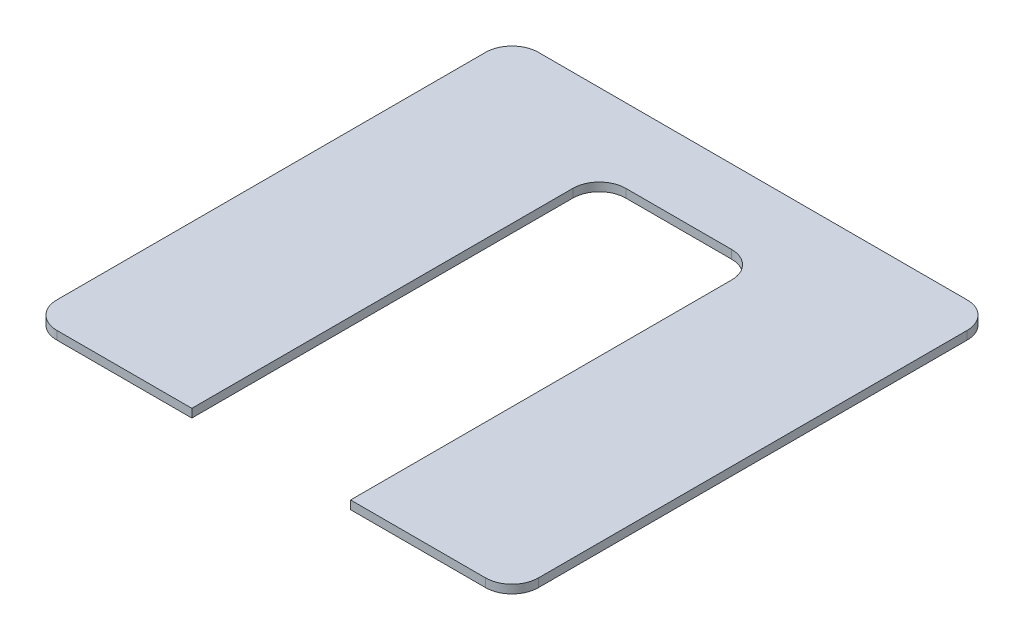
ISO-10303-21;
HEADER;
FILE_DESCRIPTION(('STEP AP214'),'2;1');
FILE_NAME('part.step','',(''),(''),'','','');
FILE_SCHEMA(('AUTOMOTIVE_DESIGN { 1 0 10303 214 1 1 1 1 }'));
ENDSEC;
DATA;
#1=APPLICATION_CONTEXT('core data for automotive mechanical design processes');
#2=APPLICATION_PROTOCOL_DEFINITION('international standard','automotive_design',2000,#1);
#3=PRODUCT_CONTEXT('',#1,'mechanical');
#4=PRODUCT('Part','Part','',(#3));
#5=PRODUCT_RELATED_PRODUCT_CATEGORY('part','',(#4));
#6=PRODUCT_DEFINITION_FORMATION('','',#4);
#7=PRODUCT_DEFINITION_CONTEXT('part definition',#1,'design');
#8=PRODUCT_DEFINITION('design','',#6,#7);
#9=PRODUCT_DEFINITION_SHAPE('','',#8);
#10=(LENGTH_UNIT() NAMED_UNIT(*) SI_UNIT(.MILLI.,.METRE.));
#11=(NAMED_UNIT(*) PLANE_ANGLE_UNIT() SI_UNIT($,.RADIAN.));
#12=(NAMED_UNIT(*) SI_UNIT($,.STERADIAN.) SOLID_ANGLE_UNIT());
#13=UNCERTAINTY_MEASURE_WITH_UNIT(LENGTH_MEASURE(1.E-05),#10,'distance_accuracy_value','');
#14=(GEOMETRIC_REPRESENTATION_CONTEXT(3) GLOBAL_UNCERTAINTY_ASSIGNED_CONTEXT((#13)) GLOBAL_UNIT_ASSIGNED_CONTEXT((#10,
#11,#12)) REPRESENTATION_CONTEXT('',''));
#15=CARTESIAN_POINT('',(0.,0.,0.));
#16=DIRECTION('',(0.,0.,1.));
#17=DIRECTION('',(1.,0.,0.));
#18=AXIS2_PLACEMENT_3D('',#15,#16,#17);
#19=CARTESIAN_POINT('',(-45.5,1.6,45.5));
#20=DIRECTION('',(0.,0.,-1.));
#21=DIRECTION('',(-1.,0.,0.));
#22=AXIS2_PLACEMENT_3D('',#19,#20,#21);
#23=PLANE('',#22);
#24=DIRECTION('',(1.,0.,0.));
#25=VECTOR('',#24,1.);
#26=CARTESIAN_POINT('',(-45.5,0.,45.5));
#27=LINE('',#26,#25);
#28=CARTESIAN_POINT('',(15.,0.,45.5));
#29=VERTEX_POINT('',#28);
#30=CARTESIAN_POINT('',(40.5,0.,45.5));
#31=VERTEX_POINT('',#30);
#32=EDGE_CURVE('E146',#29,#31,#27,.T.);
#33=ORIENTED_EDGE('',*,*,#32,.T.);
#34=DIRECTION('',(0.,-1.,0.));
#35=VECTOR('',#34,1.);
#36=CARTESIAN_POINT('',(40.5,1.6,45.5));
#37=LINE('',#36,#35);
#38=CARTESIAN_POINT('',(40.5,1.6,45.5));
#39=VERTEX_POINT('',#38);
#40=EDGE_CURVE('E215',#31,#39,#37,.F.);
#41=ORIENTED_EDGE('',*,*,#40,.T.);
#42=DIRECTION('',(1.,0.,0.));
#43=VECTOR('',#42,1.);
#44=CARTESIAN_POINT('',(-45.5,1.6,45.5));
#45=LINE('',#44,#43);
#46=CARTESIAN_POINT('',(15.,1.6,45.5));
#47=VERTEX_POINT('',#46);
#48=EDGE_CURVE('E174',#47,#39,#45,.T.);
#49=ORIENTED_EDGE('',*,*,#48,.F.);
#50=DIRECTION('',(0.,1.,0.));
#51=VECTOR('',#50,1.);
#52=CARTESIAN_POINT('',(15.,0.,45.5));
#53=LINE('',#52,#51);
#54=EDGE_CURVE('E160',#29,#47,#53,.T.);
#55=ORIENTED_EDGE('',*,*,#54,.F.);
#56=EDGE_LOOP('',(#33,#41,#49,#55));
#57=FACE_BOUND('',#56,.T.);
#58=ADVANCED_FACE('F34',(#57),#23,.F.);
#59=CARTESIAN_POINT('',(-45.5,1.6,45.5));
#60=DIRECTION('',(-1.,0.,0.));
#61=DIRECTION('',(0.,0.,1.));
#62=AXIS2_PLACEMENT_3D('',#59,#60,#61);
#63=PLANE('',#62);
#64=DIRECTION('',(0.,0.,-1.));
#65=VECTOR('',#64,1.);
#66=CARTESIAN_POINT('',(-45.5,1.6,45.5));
#67=LINE('',#66,#65);
#68=CARTESIAN_POINT('',(-45.5,1.6,40.5));
#69=VERTEX_POINT('',#68);
#70=CARTESIAN_POINT('',(-45.5,1.6,-40.5));
#71=VERTEX_POINT('',#70);
#72=EDGE_CURVE('E145',#69,#71,#67,.T.);
#73=ORIENTED_EDGE('',*,*,#72,.T.);
#74=DIRECTION('',(0.,-1.,0.));
#75=VECTOR('',#74,1.);
#76=CARTESIAN_POINT('',(-45.5,1.6,-40.5));
#77=LINE('',#76,#75);
#78=CARTESIAN_POINT('',(-45.5,0.,-40.5));
#79=VERTEX_POINT('',#78);
#80=EDGE_CURVE('E186',#71,#79,#77,.T.);
#81=ORIENTED_EDGE('',*,*,#80,.T.);
#82=DIRECTION('',(0.,0.,-1.));
#83=VECTOR('',#82,1.);
#84=CARTESIAN_POINT('',(-45.5,0.,45.5));
#85=LINE('',#84,#83);
#86=CARTESIAN_POINT('',(-45.5,0.,40.5));
#87=VERTEX_POINT('',#86);
#88=EDGE_CURVE('E162',#87,#79,#85,.T.);
#89=ORIENTED_EDGE('',*,*,#88,.F.);
#90=DIRECTION('',(0.,-1.,0.));
#91=VECTOR('',#90,1.);
#92=CARTESIAN_POINT('',(-45.5,1.6,40.5));
#93=LINE('',#92,#91);
#94=EDGE_CURVE('E177',#87,#69,#93,.F.);
#95=ORIENTED_EDGE('',*,*,#94,.T.);
#96=EDGE_LOOP('',(#73,#81,#89,#95));
#97=FACE_BOUND('',#96,.T.);
#98=ADVANCED_FACE('F248',(#97),#63,.T.);
#99=CARTESIAN_POINT('',(-40.5,1.6,45.5));
#100=VERTEX_POINT('',#99);
#101=CARTESIAN_POINT('',(-15.,1.6,45.5));
#102=VERTEX_POINT('',#101);
#103=EDGE_CURVE('E175',#100,#102,#45,.T.);
#104=ORIENTED_EDGE('',*,*,#103,.F.);
#105=DIRECTION('',(0.,-1.,0.));
#106=VECTOR('',#105,1.);
#107=CARTESIAN_POINT('',(-40.5,0.,45.5));
#108=LINE('',#107,#106);
#109=CARTESIAN_POINT('',(-40.5,0.,45.5));
#110=VERTEX_POINT('',#109);
#111=EDGE_CURVE('E143',#100,#110,#108,.T.);
#112=ORIENTED_EDGE('',*,*,#111,.T.);
#113=CARTESIAN_POINT('',(-15.,0.,45.5));
#114=VERTEX_POINT('',#113);
#115=EDGE_CURVE('E137',#110,#114,#27,.T.);
#116=ORIENTED_EDGE('',*,*,#115,.T.);
#117=DIRECTION('',(0.,1.,0.));
#118=VECTOR('',#117,1.);
#119=CARTESIAN_POINT('',(-15.,0.,45.5));
#120=LINE('',#119,#118);
#121=EDGE_CURVE('E141',#114,#102,#120,.T.);
#122=ORIENTED_EDGE('',*,*,#121,.T.);
#123=EDGE_LOOP('',(#104,#112,#116,#122));
#124=FACE_BOUND('',#123,.T.);
#125=ADVANCED_FACE('F139',(#124),#23,.F.);
#126=CARTESIAN_POINT('',(45.5,1.6,45.5));
#127=DIRECTION('',(-1.,0.,0.));
#128=DIRECTION('',(0.,0.,1.));
#129=AXIS2_PLACEMENT_3D('',#126,#127,#128);
#130=PLANE('',#129);
#131=DIRECTION('',(0.,0.,-1.));
#132=VECTOR('',#131,1.);
#133=CARTESIAN_POINT('',(45.5,1.6,45.5));
#134=LINE('',#133,#132);
#135=CARTESIAN_POINT('',(45.5,1.6,40.5));
#136=VERTEX_POINT('',#135);
#137=CARTESIAN_POINT('',(45.5,1.6,-40.5));
#138=VERTEX_POINT('',#137);
#139=EDGE_CURVE('E171',#136,#138,#134,.T.);
#140=ORIENTED_EDGE('',*,*,#139,.F.);
#141=DIRECTION('',(0.,-1.,0.));
#142=VECTOR('',#141,1.);
#143=CARTESIAN_POINT('',(45.5,1.6,40.5));
#144=LINE('',#143,#142);
#145=CARTESIAN_POINT('',(45.5,0.,40.5));
#146=VERTEX_POINT('',#145);
#147=EDGE_CURVE('E212',#136,#146,#144,.T.);
#148=ORIENTED_EDGE('',*,*,#147,.T.);
#149=DIRECTION('',(0.,0.,-1.));
#150=VECTOR('',#149,1.);
#151=CARTESIAN_POINT('',(45.5,0.,45.5));
#152=LINE('',#151,#150);
#153=CARTESIAN_POINT('',(45.5,0.,-40.5));
#154=VERTEX_POINT('',#153);
#155=EDGE_CURVE('E182',#146,#154,#152,.T.);
#156=ORIENTED_EDGE('',*,*,#155,.T.);
#157=DIRECTION('',(0.,-1.,0.));
#158=VECTOR('',#157,1.);
#159=CARTESIAN_POINT('',(45.5,1.6,-40.5));
#160=LINE('',#159,#158);
#161=EDGE_CURVE('E210',#154,#138,#160,.F.);
#162=ORIENTED_EDGE('',*,*,#161,.T.);
#163=EDGE_LOOP('',(#140,#148,#156,#162));
#164=FACE_BOUND('',#163,.T.);
#165=ADVANCED_FACE('F260',(#164),#130,.F.);
#166=CARTESIAN_POINT('',(-45.5,1.6,-45.5));
#167=DIRECTION('',(0.,0.,-1.));
#168=DIRECTION('',(-1.,0.,0.));
#169=AXIS2_PLACEMENT_3D('',#166,#167,#168);
#170=PLANE('',#169);
#171=DIRECTION('',(1.,0.,0.));
#172=VECTOR('',#171,1.);
#173=CARTESIAN_POINT('',(-45.5,0.,-45.5));
#174=LINE('',#173,#172);
#175=CARTESIAN_POINT('',(-40.5,0.,-45.5));
#176=VERTEX_POINT('',#175);
#177=CARTESIAN_POINT('',(40.5,0.,-45.5));
#178=VERTEX_POINT('',#177);
#179=EDGE_CURVE('E179',#176,#178,#174,.T.);
#180=ORIENTED_EDGE('',*,*,#179,.F.);
#181=DIRECTION('',(0.,-1.,0.));
#182=VECTOR('',#181,1.);
#183=CARTESIAN_POINT('',(-40.5,1.6,-45.5));
#184=LINE('',#183,#182);
#185=CARTESIAN_POINT('',(-40.5,1.6,-45.5));
#186=VERTEX_POINT('',#185);
#187=EDGE_CURVE('E200',#176,#186,#184,.F.);
#188=ORIENTED_EDGE('',*,*,#187,.T.);
#189=DIRECTION('',(1.,0.,0.));
#190=VECTOR('',#189,1.);
#191=CARTESIAN_POINT('',(-45.5,1.6,-45.5));
#192=LINE('',#191,#190);
#193=CARTESIAN_POINT('',(40.5,1.6,-45.5));
#194=VERTEX_POINT('',#193);
#195=EDGE_CURVE('E168',#186,#194,#192,.T.);
#196=ORIENTED_EDGE('',*,*,#195,.T.);
#197=DIRECTION('',(0.,-1.,0.));
#198=VECTOR('',#197,1.);
#199=CARTESIAN_POINT('',(40.5,0.,-45.5));
#200=LINE('',#199,#198);
#201=EDGE_CURVE('E197',#194,#178,#200,.T.);
#202=ORIENTED_EDGE('',*,*,#201,.T.);
#203=EDGE_LOOP('',(#180,#188,#196,#202));
#204=FACE_BOUND('',#203,.T.);
#205=ADVANCED_FACE('F264',(#204),#170,.T.);
#206=CARTESIAN_POINT('',(0.,1.6,0.));
#207=DIRECTION('',(0.,-1.,0.));
#208=DIRECTION('',(0.,0.,-1.));
#209=AXIS2_PLACEMENT_3D('',#206,#207,#208);
#210=PLANE('',#209);
#211=ORIENTED_EDGE('',*,*,#195,.F.);
#212=CARTESIAN_POINT('',(-40.5,1.6,-40.5));
#213=DIRECTION('',(0.,-1.,0.));
#214=DIRECTION('',(0.,0.,-1.));
#215=AXIS2_PLACEMENT_3D('',#212,#213,#214);
#216=CIRCLE('',#215,5.);
#217=EDGE_CURVE('E207',#186,#71,#216,.F.);
#218=ORIENTED_EDGE('',*,*,#217,.T.);
#219=ORIENTED_EDGE('',*,*,#72,.F.);
#220=CARTESIAN_POINT('',(-40.5,1.6,40.5));
#221=DIRECTION('',(0.,-1.,0.));
#222=DIRECTION('',(0.,0.,-1.));
#223=AXIS2_PLACEMENT_3D('',#220,#221,#222);
#224=CIRCLE('',#223,5.);
#225=EDGE_CURVE('E56',#69,#100,#224,.F.);
#226=ORIENTED_EDGE('',*,*,#225,.T.);
#227=ORIENTED_EDGE('',*,*,#103,.T.);
#228=DIRECTION('',(0.,0.,1.));
#229=VECTOR('',#228,1.);
#230=CARTESIAN_POINT('',(-15.,1.6,-31.5));
#231=LINE('',#230,#229);
#232=CARTESIAN_POINT('',(-15.,1.6,-26.5));
#233=VERTEX_POINT('',#232);
#234=EDGE_CURVE('E159',#233,#102,#231,.T.);
#235=ORIENTED_EDGE('',*,*,#234,.F.);
#236=CARTESIAN_POINT('',(-9.99999999999999,1.6,-26.5));
#237=DIRECTION('',(0.,-1.,0.));
#238=DIRECTION('',(0.,0.,-1.));
#239=AXIS2_PLACEMENT_3D('',#236,#237,#238);
#240=CIRCLE('',#239,5.);
#241=CARTESIAN_POINT('',(-9.99999999999999,1.6,-31.5));
#242=VERTEX_POINT('',#241);
#243=EDGE_CURVE('E42',#233,#242,#240,.T.);
#244=ORIENTED_EDGE('',*,*,#243,.T.);
#245=DIRECTION('',(-1.,0.,0.));
#246=VECTOR('',#245,1.);
#247=CARTESIAN_POINT('',(-15.,1.6,-31.5));
#248=LINE('',#247,#246);
#249=CARTESIAN_POINT('',(10.,1.6,-31.5));
#250=VERTEX_POINT('',#249);
#251=EDGE_CURVE('E233',#250,#242,#248,.T.);
#252=ORIENTED_EDGE('',*,*,#251,.F.);
#253=CARTESIAN_POINT('',(10.,1.6,-26.5));
#254=DIRECTION('',(0.,-1.,0.));
#255=DIRECTION('',(0.,0.,-1.));
#256=AXIS2_PLACEMENT_3D('',#253,#254,#255);
#257=CIRCLE('',#256,5.);
#258=CARTESIAN_POINT('',(15.,1.6,-26.5));
#259=VERTEX_POINT('',#258);
#260=EDGE_CURVE('E226',#250,#259,#257,.T.);
#261=ORIENTED_EDGE('',*,*,#260,.T.);
#262=DIRECTION('',(0.,0.,-1.));
#263=VECTOR('',#262,1.);
#264=CARTESIAN_POINT('',(15.,1.6,-31.5));
#265=LINE('',#264,#263);
#266=EDGE_CURVE('E238',#47,#259,#265,.T.);
#267=ORIENTED_EDGE('',*,*,#266,.F.);
#268=ORIENTED_EDGE('',*,*,#48,.T.);
#269=CARTESIAN_POINT('',(40.5,1.6,40.5));
#270=DIRECTION('',(0.,-1.,0.));
#271=DIRECTION('',(0.,0.,-1.));
#272=AXIS2_PLACEMENT_3D('',#269,#270,#271);
#273=CIRCLE('',#272,5.);
#274=EDGE_CURVE('E204',#39,#136,#273,.F.);
#275=ORIENTED_EDGE('',*,*,#274,.T.);
#276=ORIENTED_EDGE('',*,*,#139,.T.);
#277=CARTESIAN_POINT('',(40.5,1.6,-40.5));
#278=DIRECTION('',(0.,-1.,0.));
#279=DIRECTION('',(0.,0.,-1.));
#280=AXIS2_PLACEMENT_3D('',#277,#278,#279);
#281=CIRCLE('',#280,5.);
#282=EDGE_CURVE('E202',#138,#194,#281,.F.);
#283=ORIENTED_EDGE('',*,*,#282,.T.);
#284=EDGE_LOOP('',(#211,#218,#219,#226,#227,#235,#244,#252,#261,#267,#268,#275,#276,#283));
#285=FACE_BOUND('',#284,.T.);
#286=ADVANCED_FACE('F232',(#285),#210,.F.);
#287=CARTESIAN_POINT('',(0.,0.,0.));
#288=DIRECTION('',(0.,-1.,0.));
#289=DIRECTION('',(0.,0.,-1.));
#290=AXIS2_PLACEMENT_3D('',#287,#288,#289);
#291=PLANE('',#290);
#292=ORIENTED_EDGE('',*,*,#88,.T.);
#293=CARTESIAN_POINT('',(-40.5,0.,-40.5));
#294=DIRECTION('',(0.,-1.,0.));
#295=DIRECTION('',(0.,0.,-1.));
#296=AXIS2_PLACEMENT_3D('',#293,#294,#295);
#297=CIRCLE('',#296,5.);
#298=EDGE_CURVE('E195',#79,#176,#297,.T.);
#299=ORIENTED_EDGE('',*,*,#298,.T.);
#300=ORIENTED_EDGE('',*,*,#179,.T.);
#301=CARTESIAN_POINT('',(40.5,0.,-40.5));
#302=DIRECTION('',(0.,-1.,0.));
#303=DIRECTION('',(0.,0.,-1.));
#304=AXIS2_PLACEMENT_3D('',#301,#302,#303);
#305=CIRCLE('',#304,5.);
#306=EDGE_CURVE('E189',#178,#154,#305,.T.);
#307=ORIENTED_EDGE('',*,*,#306,.T.);
#308=ORIENTED_EDGE('',*,*,#155,.F.);
#309=CARTESIAN_POINT('',(40.5,0.,40.5));
#310=DIRECTION('',(0.,-1.,0.));
#311=DIRECTION('',(0.,0.,-1.));
#312=AXIS2_PLACEMENT_3D('',#309,#310,#311);
#313=CIRCLE('',#312,5.);
#314=EDGE_CURVE('E191',#146,#31,#313,.T.);
#315=ORIENTED_EDGE('',*,*,#314,.T.);
#316=ORIENTED_EDGE('',*,*,#32,.F.);
#317=DIRECTION('',(0.,0.,-1.));
#318=VECTOR('',#317,1.);
#319=CARTESIAN_POINT('',(15.,0.,-31.5));
#320=LINE('',#319,#318);
#321=CARTESIAN_POINT('',(15.,0.,-26.5));
#322=VERTEX_POINT('',#321);
#323=EDGE_CURVE('E312',#29,#322,#320,.T.);
#324=ORIENTED_EDGE('',*,*,#323,.T.);
#325=CARTESIAN_POINT('',(10.,0.,-26.5));
#326=DIRECTION('',(0.,-1.,0.));
#327=DIRECTION('',(0.,0.,-1.));
#328=AXIS2_PLACEMENT_3D('',#325,#326,#327);
#329=CIRCLE('',#328,5.);
#330=CARTESIAN_POINT('',(10.,0.,-31.5));
#331=VERTEX_POINT('',#330);
#332=EDGE_CURVE('E228',#322,#331,#329,.F.);
#333=ORIENTED_EDGE('',*,*,#332,.T.);
#334=DIRECTION('',(-1.,0.,0.));
#335=VECTOR('',#334,1.);
#336=CARTESIAN_POINT('',(-15.,0.,-31.5));
#337=LINE('',#336,#335);
#338=CARTESIAN_POINT('',(-9.99999999999999,0.,-31.5));
#339=VERTEX_POINT('',#338);
#340=EDGE_CURVE('E155',#331,#339,#337,.T.);
#341=ORIENTED_EDGE('',*,*,#340,.T.);
#342=CARTESIAN_POINT('',(-9.99999999999999,0.,-26.5));
#343=DIRECTION('',(0.,-1.,0.));
#344=DIRECTION('',(0.,0.,-1.));
#345=AXIS2_PLACEMENT_3D('',#342,#343,#344);
#346=CIRCLE('',#345,5.);
#347=CARTESIAN_POINT('',(-15.,0.,-26.5));
#348=VERTEX_POINT('',#347);
#349=EDGE_CURVE('E11',#339,#348,#346,.F.);
#350=ORIENTED_EDGE('',*,*,#349,.T.);
#351=DIRECTION('',(0.,0.,1.));
#352=VECTOR('',#351,1.);
#353=CARTESIAN_POINT('',(-15.,0.,-31.5));
#354=LINE('',#353,#352);
#355=EDGE_CURVE('E149',#348,#114,#354,.T.);
#356=ORIENTED_EDGE('',*,*,#355,.T.);
#357=ORIENTED_EDGE('',*,*,#115,.F.);
#358=CARTESIAN_POINT('',(-40.5,0.,40.5));
#359=DIRECTION('',(0.,-1.,0.));
#360=DIRECTION('',(0.,0.,-1.));
#361=AXIS2_PLACEMENT_3D('',#358,#359,#360);
#362=CIRCLE('',#361,5.);
#363=EDGE_CURVE('E193',#110,#87,#362,.T.);
#364=ORIENTED_EDGE('',*,*,#363,.T.);
#365=EDGE_LOOP('',(#292,#299,#300,#307,#308,#315,#316,#324,#333,#341,#350,#356,#357,#364));
#366=FACE_BOUND('',#365,.T.);
#367=ADVANCED_FACE('F151',(#366),#291,.T.);
#368=CARTESIAN_POINT('',(15.,0.,-31.5));
#369=DIRECTION('',(1.,0.,0.));
#370=DIRECTION('',(0.,0.,-1.));
#371=AXIS2_PLACEMENT_3D('',#368,#369,#370);
#372=PLANE('',#371);
#373=ORIENTED_EDGE('',*,*,#266,.T.);
#374=DIRECTION('',(0.,1.,0.));
#375=VECTOR('',#374,1.);
#376=CARTESIAN_POINT('',(15.,0.,-26.5));
#377=LINE('',#376,#375);
#378=EDGE_CURVE('E222',#259,#322,#377,.F.);
#379=ORIENTED_EDGE('',*,*,#378,.T.);
#380=ORIENTED_EDGE('',*,*,#323,.F.);
#381=ORIENTED_EDGE('',*,*,#54,.T.);
#382=EDGE_LOOP('',(#373,#379,#380,#381));
#383=FACE_BOUND('',#382,.T.);
#384=ADVANCED_FACE('F310',(#383),#372,.F.);
#385=CARTESIAN_POINT('',(-15.,0.,-31.5));
#386=DIRECTION('',(-1.,0.,0.));
#387=DIRECTION('',(0.,0.,1.));
#388=AXIS2_PLACEMENT_3D('',#385,#386,#387);
#389=PLANE('',#388);
#390=ORIENTED_EDGE('',*,*,#355,.F.);
#391=DIRECTION('',(0.,1.,0.));
#392=VECTOR('',#391,1.);
#393=CARTESIAN_POINT('',(-15.,1.6,-26.5));
#394=LINE('',#393,#392);
#395=EDGE_CURVE('E224',#348,#233,#394,.T.);
#396=ORIENTED_EDGE('',*,*,#395,.T.);
#397=ORIENTED_EDGE('',*,*,#234,.T.);
#398=ORIENTED_EDGE('',*,*,#121,.F.);
#399=EDGE_LOOP('',(#390,#396,#397,#398));
#400=FACE_BOUND('',#399,.T.);
#401=ADVANCED_FACE('F157',(#400),#389,.F.);
#402=CARTESIAN_POINT('',(-15.,0.,-31.5));
#403=DIRECTION('',(0.,0.,-1.));
#404=DIRECTION('',(-1.,0.,0.));
#405=AXIS2_PLACEMENT_3D('',#402,#403,#404);
#406=PLANE('',#405);
#407=ORIENTED_EDGE('',*,*,#340,.F.);
#408=DIRECTION('',(0.,1.,0.));
#409=VECTOR('',#408,1.);
#410=CARTESIAN_POINT('',(10.,1.6,-31.5));
#411=LINE('',#410,#409);
#412=EDGE_CURVE('E219',#331,#250,#411,.T.);
#413=ORIENTED_EDGE('',*,*,#412,.T.);
#414=ORIENTED_EDGE('',*,*,#251,.T.);
#415=DIRECTION('',(0.,1.,0.));
#416=VECTOR('',#415,1.);
#417=CARTESIAN_POINT('',(-9.99999999999999,0.,-31.5));
#418=LINE('',#417,#416);
#419=EDGE_CURVE('E217',#242,#339,#418,.F.);
#420=ORIENTED_EDGE('',*,*,#419,.T.);
#421=EDGE_LOOP('',(#407,#413,#414,#420));
#422=FACE_BOUND('',#421,.T.);
#423=ADVANCED_FACE('F236',(#422),#406,.F.);
#424=CARTESIAN_POINT('',(-40.5,1.6,-40.5));
#425=DIRECTION('',(0.,-1.,0.));
#426=DIRECTION('',(0.,0.,-1.));
#427=AXIS2_PLACEMENT_3D('',#424,#425,#426);
#428=CYLINDRICAL_SURFACE('',#427,5.);
#429=ORIENTED_EDGE('',*,*,#217,.F.);
#430=ORIENTED_EDGE('',*,*,#187,.F.);
#431=ORIENTED_EDGE('',*,*,#298,.F.);
#432=ORIENTED_EDGE('',*,*,#80,.F.);
#433=EDGE_LOOP('',(#429,#430,#431,#432));
#434=FACE_BOUND('',#433,.T.);
#435=ADVANCED_FACE('F273',(#434),#428,.T.);
#436=CARTESIAN_POINT('',(-40.5,1.6,40.5));
#437=DIRECTION('',(0.,1.,0.));
#438=DIRECTION('',(0.,0.,1.));
#439=AXIS2_PLACEMENT_3D('',#436,#437,#438);
#440=CYLINDRICAL_SURFACE('',#439,5.);
#441=ORIENTED_EDGE('',*,*,#225,.F.);
#442=ORIENTED_EDGE('',*,*,#94,.F.);
#443=ORIENTED_EDGE('',*,*,#363,.F.);
#444=ORIENTED_EDGE('',*,*,#111,.F.);
#445=EDGE_LOOP('',(#441,#442,#443,#444));
#446=FACE_BOUND('',#445,.T.);
#447=ADVANCED_FACE('F276',(#446),#440,.T.);
#448=CARTESIAN_POINT('',(40.5,1.6,40.5));
#449=DIRECTION('',(0.,-1.,0.));
#450=DIRECTION('',(0.,0.,-1.));
#451=AXIS2_PLACEMENT_3D('',#448,#449,#450);
#452=CYLINDRICAL_SURFACE('',#451,5.);
#453=ORIENTED_EDGE('',*,*,#274,.F.);
#454=ORIENTED_EDGE('',*,*,#40,.F.);
#455=ORIENTED_EDGE('',*,*,#314,.F.);
#456=ORIENTED_EDGE('',*,*,#147,.F.);
#457=EDGE_LOOP('',(#453,#454,#455,#456));
#458=FACE_BOUND('',#457,.T.);
#459=ADVANCED_FACE('F280',(#458),#452,.T.);
#460=CARTESIAN_POINT('',(40.5,1.6,-40.5));
#461=DIRECTION('',(0.,1.,0.));
#462=DIRECTION('',(0.,0.,1.));
#463=AXIS2_PLACEMENT_3D('',#460,#461,#462);
#464=CYLINDRICAL_SURFACE('',#463,5.);
#465=ORIENTED_EDGE('',*,*,#282,.F.);
#466=ORIENTED_EDGE('',*,*,#161,.F.);
#467=ORIENTED_EDGE('',*,*,#306,.F.);
#468=ORIENTED_EDGE('',*,*,#201,.F.);
#469=EDGE_LOOP('',(#465,#466,#467,#468));
#470=FACE_BOUND('',#469,.T.);
#471=ADVANCED_FACE('F245',(#470),#464,.T.);
#472=CARTESIAN_POINT('',(10.,0.,-26.5));
#473=DIRECTION('',(0.,-1.,0.));
#474=DIRECTION('',(0.,0.,-1.));
#475=AXIS2_PLACEMENT_3D('',#472,#473,#474);
#476=CYLINDRICAL_SURFACE('',#475,5.);
#477=ORIENTED_EDGE('',*,*,#332,.F.);
#478=ORIENTED_EDGE('',*,*,#378,.F.);
#479=ORIENTED_EDGE('',*,*,#260,.F.);
#480=ORIENTED_EDGE('',*,*,#412,.F.);
#481=EDGE_LOOP('',(#477,#478,#479,#480));
#482=FACE_BOUND('',#481,.T.);
#483=ADVANCED_FACE('F241',(#482),#476,.F.);
#484=CARTESIAN_POINT('',(-9.99999999999999,0.,-26.5));
#485=DIRECTION('',(0.,-1.,0.));
#486=DIRECTION('',(0.,0.,-1.));
#487=AXIS2_PLACEMENT_3D('',#484,#485,#486);
#488=CYLINDRICAL_SURFACE('',#487,5.);
#489=ORIENTED_EDGE('',*,*,#349,.F.);
#490=ORIENTED_EDGE('',*,*,#419,.F.);
#491=ORIENTED_EDGE('',*,*,#243,.F.);
#492=ORIENTED_EDGE('',*,*,#395,.F.);
#493=EDGE_LOOP('',(#489,#490,#491,#492));
#494=FACE_BOUND('',#493,.T.);
#495=ADVANCED_FACE('F36',(#494),#488,.F.);
#496=CLOSED_SHELL('',(#58,#98,#125,#165,#205,#286,#367,#384,#401,#423,#435,#447,#459,#471,#483,#495));
#497=MANIFOLD_SOLID_BREP('B2',#496);
#498=ADVANCED_BREP_SHAPE_REPRESENTATION('',(#18,#497),#14);
#499=SHAPE_DEFINITION_REPRESENTATION(#9,#498);
ENDSEC;
END-ISO-10303-21;
